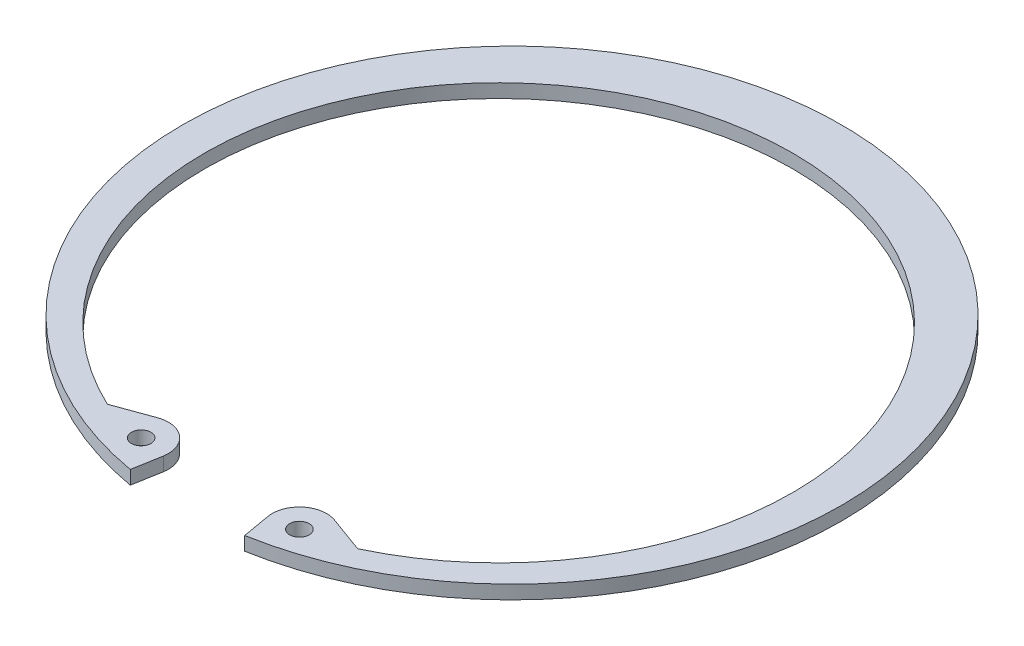
ISO-10303-21;
HEADER;
FILE_DESCRIPTION(('STEP AP214'),'2;1');
FILE_NAME('part.step','',(''),(''),'','','');
FILE_SCHEMA(('AUTOMOTIVE_DESIGN { 1 0 10303 214 1 1 1 1 }'));
ENDSEC;
DATA;
#1=APPLICATION_CONTEXT('core data for automotive mechanical design processes');
#2=APPLICATION_PROTOCOL_DEFINITION('international standard','automotive_design',2000,#1);
#3=PRODUCT_CONTEXT('',#1,'mechanical');
#4=PRODUCT('Part','Part','',(#3));
#5=PRODUCT_RELATED_PRODUCT_CATEGORY('part','',(#4));
#6=PRODUCT_DEFINITION_FORMATION('','',#4);
#7=PRODUCT_DEFINITION_CONTEXT('part definition',#1,'design');
#8=PRODUCT_DEFINITION('design','',#6,#7);
#9=PRODUCT_DEFINITION_SHAPE('','',#8);
#10=(LENGTH_UNIT() NAMED_UNIT(*) SI_UNIT(.MILLI.,.METRE.));
#11=(NAMED_UNIT(*) PLANE_ANGLE_UNIT() SI_UNIT($,.RADIAN.));
#12=(NAMED_UNIT(*) SI_UNIT($,.STERADIAN.) SOLID_ANGLE_UNIT());
#13=UNCERTAINTY_MEASURE_WITH_UNIT(LENGTH_MEASURE(1.E-05),#10,'distance_accuracy_value','');
#14=(GEOMETRIC_REPRESENTATION_CONTEXT(3) GLOBAL_UNCERTAINTY_ASSIGNED_CONTEXT((#13)) GLOBAL_UNIT_ASSIGNED_CONTEXT((#10,
#11,#12)) REPRESENTATION_CONTEXT('',''));
#15=CARTESIAN_POINT('',(0.,0.,0.));
#16=DIRECTION('',(0.,0.,1.));
#17=DIRECTION('',(1.,0.,0.));
#18=AXIS2_PLACEMENT_3D('',#15,#16,#17);
#19=CARTESIAN_POINT('',(16.0379644782758,-2.7686,59.1414888351956));
#20=DIRECTION('',(0.,1.,0.));
#21=DIRECTION('',(0.,0.,1.));
#22=AXIS2_PLACEMENT_3D('',#19,#20,#21);
#23=CYLINDRICAL_SURFACE('',#22,5.5245);
#24=CARTESIAN_POINT('',(16.0379644782758,0.,59.1414888351956));
#25=DIRECTION('',(0.,1.,0.));
#26=DIRECTION('',(0.,0.,-1.));
#27=AXIS2_PLACEMENT_3D('',#24,#25,#26);
#28=CIRCLE('',#27,5.5245);
#29=CARTESIAN_POINT('',(17.9274547600785,0.,53.9501569516638));
#30=VERTEX_POINT('',#29);
#31=CARTESIAN_POINT('',(10.5973940467599,0.,60.1008081927165));
#32=VERTEX_POINT('',#31);
#33=EDGE_CURVE('E160',#30,#32,#28,.T.);
#34=ORIENTED_EDGE('',*,*,#33,.F.);
#35=DIRECTION('',(0.,1.,0.));
#36=VECTOR('',#35,1.);
#37=CARTESIAN_POINT('',(17.9274547600785,-2.7686,53.9501569516638));
#38=LINE('',#37,#36);
#39=CARTESIAN_POINT('',(17.9274547600785,-2.7686,53.9501569516638));
#40=VERTEX_POINT('',#39);
#41=EDGE_CURVE('E137',#40,#30,#38,.T.);
#42=ORIENTED_EDGE('',*,*,#41,.F.);
#43=CARTESIAN_POINT('',(16.0379644782758,-2.7686,59.1414888351956));
#44=DIRECTION('',(0.,1.,0.));
#45=DIRECTION('',(0.,0.,-1.));
#46=AXIS2_PLACEMENT_3D('',#43,#44,#45);
#47=CIRCLE('',#46,5.5245);
#48=CARTESIAN_POINT('',(10.5973940467599,-2.7686,60.1008081927165));
#49=VERTEX_POINT('',#48);
#50=EDGE_CURVE('E130',#40,#49,#47,.T.);
#51=ORIENTED_EDGE('',*,*,#50,.T.);
#52=DIRECTION('',(0.,1.,0.));
#53=VECTOR('',#52,1.);
#54=CARTESIAN_POINT('',(10.5973940467599,-2.7686,60.1008081927165));
#55=LINE('',#54,#53);
#56=EDGE_CURVE('E113',#49,#32,#55,.T.);
#57=ORIENTED_EDGE('',*,*,#56,.T.);
#58=EDGE_LOOP('',(#34,#42,#51,#57));
#59=FACE_BOUND('',#58,.T.);
#60=ADVANCED_FACE('F38',(#59),#23,.T.);
#61=CARTESIAN_POINT('',(25.3672468382028,-2.7686,56.6580198172306));
#62=DIRECTION('',(0.342020143325672,0.,-0.939692620785907));
#63=DIRECTION('',(-0.939692620785907,0.,-0.342020143325672));
#64=AXIS2_PLACEMENT_3D('',#61,#62,#63);
#65=PLANE('',#64);
#66=DIRECTION('',(-0.939692620785907,0.,-0.342020143325672));
#67=VECTOR('',#66,1.);
#68=CARTESIAN_POINT('',(25.3672468382028,0.,56.6580198172306));
#69=LINE('',#68,#67);
#70=CARTESIAN_POINT('',(25.2678041406054,0.,56.62182563529));
#71=VERTEX_POINT('',#70);
#72=EDGE_CURVE('E138',#71,#30,#69,.T.);
#73=ORIENTED_EDGE('',*,*,#72,.F.);
#74=DIRECTION('',(0.,-1.,0.));
#75=VECTOR('',#74,1.);
#76=CARTESIAN_POINT('',(25.2678041406054,-2.7686,56.62182563529));
#77=LINE('',#76,#75);
#78=CARTESIAN_POINT('',(25.2678041406054,-2.7686,56.62182563529));
#79=VERTEX_POINT('',#78);
#80=EDGE_CURVE('E53',#71,#79,#77,.T.);
#81=ORIENTED_EDGE('',*,*,#80,.T.);
#82=DIRECTION('',(-0.939692620785907,0.,-0.342020143325672));
#83=VECTOR('',#82,1.);
#84=CARTESIAN_POINT('',(25.3672468382028,-2.7686,56.6580198172306));
#85=LINE('',#84,#83);
#86=EDGE_CURVE('E124',#79,#40,#85,.T.);
#87=ORIENTED_EDGE('',*,*,#86,.T.);
#88=ORIENTED_EDGE('',*,*,#41,.T.);
#89=EDGE_LOOP('',(#73,#81,#87,#88));
#90=FACE_BOUND('',#89,.T.);
#91=ADVANCED_FACE('F215',(#90),#65,.T.);
#92=CARTESIAN_POINT('',(0.,-2.7686,2.71445082592515));
#93=DIRECTION('',(0.,1.,0.));
#94=DIRECTION('',(0.,0.,1.));
#95=AXIS2_PLACEMENT_3D('',#92,#93,#94);
#96=CYLINDRICAL_SURFACE('',#95,59.6104508259251);
#97=CARTESIAN_POINT('',(0.,0.,2.71445082592515));
#98=DIRECTION('',(0.,-1.,0.));
#99=DIRECTION('',(0.,0.,1.));
#100=AXIS2_PLACEMENT_3D('',#97,#98,#99);
#101=CIRCLE('',#100,59.6104508259251);
#102=CARTESIAN_POINT('',(-25.4631757931198,0.,56.6128044760944));
#103=VERTEX_POINT('',#102);
#104=CARTESIAN_POINT('',(25.4631757931198,0.,56.6128044760945));
#105=VERTEX_POINT('',#104);
#106=EDGE_CURVE('E140',#103,#105,#101,.T.);
#107=ORIENTED_EDGE('',*,*,#106,.F.);
#108=DIRECTION('',(0.,1.,0.));
#109=VECTOR('',#108,1.);
#110=CARTESIAN_POINT('',(-25.4631757931198,-2.7686,56.6128044760944));
#111=LINE('',#110,#109);
#112=CARTESIAN_POINT('',(-25.4631757931198,-2.7686,56.6128044760944));
#113=VERTEX_POINT('',#112);
#114=EDGE_CURVE('E191',#103,#113,#111,.F.);
#115=ORIENTED_EDGE('',*,*,#114,.T.);
#116=CARTESIAN_POINT('',(0.,-2.7686,2.71445082592515));
#117=DIRECTION('',(0.,-1.,0.));
#118=DIRECTION('',(0.,0.,1.));
#119=AXIS2_PLACEMENT_3D('',#116,#117,#118);
#120=CIRCLE('',#119,59.6104508259251);
#121=CARTESIAN_POINT('',(25.4631757931198,-2.7686,56.6128044760945));
#122=VERTEX_POINT('',#121);
#123=EDGE_CURVE('E156',#113,#122,#120,.T.);
#124=ORIENTED_EDGE('',*,*,#123,.T.);
#125=DIRECTION('',(0.,1.,0.));
#126=VECTOR('',#125,1.);
#127=CARTESIAN_POINT('',(25.4631757931198,-2.7686,56.6128044760945));
#128=LINE('',#127,#126);
#129=EDGE_CURVE('E188',#122,#105,#128,.T.);
#130=ORIENTED_EDGE('',*,*,#129,.T.);
#131=EDGE_LOOP('',(#107,#115,#124,#130));
#132=FACE_BOUND('',#131,.T.);
#133=ADVANCED_FACE('F211',(#132),#96,.F.);
#134=CARTESIAN_POINT('',(-25.3672468382028,-2.7686,56.6580198172306));
#135=DIRECTION('',(-0.342020143325667,0.,-0.939692620785909));
#136=DIRECTION('',(-0.939692620785909,0.,0.342020143325667));
#137=AXIS2_PLACEMENT_3D('',#134,#135,#136);
#138=PLANE('',#137);
#139=DIRECTION('',(-0.939692620785909,0.,0.342020143325667));
#140=VECTOR('',#139,1.);
#141=CARTESIAN_POINT('',(-25.3672468382028,-2.7686,56.6580198172306));
#142=LINE('',#141,#140);
#143=CARTESIAN_POINT('',(-17.9274547600784,-2.7686,53.9501569516638));
#144=VERTEX_POINT('',#143);
#145=CARTESIAN_POINT('',(-25.2678041406054,-2.7686,56.62182563529));
#146=VERTEX_POINT('',#145);
#147=EDGE_CURVE('E153',#144,#146,#142,.T.);
#148=ORIENTED_EDGE('',*,*,#147,.T.);
#149=DIRECTION('',(0.,-1.,0.));
#150=VECTOR('',#149,1.);
#151=CARTESIAN_POINT('',(-25.2678041406054,0.,56.62182563529));
#152=LINE('',#151,#150);
#153=CARTESIAN_POINT('',(-25.2678041406054,0.,56.62182563529));
#154=VERTEX_POINT('',#153);
#155=EDGE_CURVE('E178',#146,#154,#152,.F.);
#156=ORIENTED_EDGE('',*,*,#155,.T.);
#157=DIRECTION('',(-0.939692620785909,0.,0.342020143325667));
#158=VECTOR('',#157,1.);
#159=CARTESIAN_POINT('',(-25.3672468382028,0.,56.6580198172306));
#160=LINE('',#159,#158);
#161=CARTESIAN_POINT('',(-17.9274547600784,0.,53.9501569516638));
#162=VERTEX_POINT('',#161);
#163=EDGE_CURVE('E173',#162,#154,#160,.T.);
#164=ORIENTED_EDGE('',*,*,#163,.F.);
#165=DIRECTION('',(0.,1.,0.));
#166=VECTOR('',#165,1.);
#167=CARTESIAN_POINT('',(-17.9274547600784,-2.7686,53.9501569516638));
#168=LINE('',#167,#166);
#169=EDGE_CURVE('E179',#144,#162,#168,.T.);
#170=ORIENTED_EDGE('',*,*,#169,.F.);
#171=EDGE_LOOP('',(#148,#156,#164,#170));
#172=FACE_BOUND('',#171,.T.);
#173=ADVANCED_FACE('F205',(#172),#138,.T.);
#174=CARTESIAN_POINT('',(-16.0379644782758,-2.7686,59.1414888351956));
#175=DIRECTION('',(0.,1.,0.));
#176=DIRECTION('',(0.,0.,1.));
#177=AXIS2_PLACEMENT_3D('',#174,#175,#176);
#178=CYLINDRICAL_SURFACE('',#177,5.5245);
#179=CARTESIAN_POINT('',(-16.0379644782758,0.,59.1414888351956));
#180=DIRECTION('',(0.,1.,0.));
#181=DIRECTION('',(0.,0.,1.));
#182=AXIS2_PLACEMENT_3D('',#179,#180,#181);
#183=CIRCLE('',#182,5.5245);
#184=CARTESIAN_POINT('',(-10.5973940467599,0.,60.1008081927165));
#185=VERTEX_POINT('',#184);
#186=EDGE_CURVE('E170',#185,#162,#183,.T.);
#187=ORIENTED_EDGE('',*,*,#186,.F.);
#188=DIRECTION('',(0.,1.,0.));
#189=VECTOR('',#188,1.);
#190=CARTESIAN_POINT('',(-10.5973940467599,-2.7686,60.1008081927165));
#191=LINE('',#190,#189);
#192=CARTESIAN_POINT('',(-10.5973940467599,-2.7686,60.1008081927165));
#193=VERTEX_POINT('',#192);
#194=EDGE_CURVE('E181',#193,#185,#191,.T.);
#195=ORIENTED_EDGE('',*,*,#194,.F.);
#196=CARTESIAN_POINT('',(-16.0379644782758,-2.7686,59.1414888351956));
#197=DIRECTION('',(0.,1.,0.));
#198=DIRECTION('',(0.,0.,1.));
#199=AXIS2_PLACEMENT_3D('',#196,#197,#198);
#200=CIRCLE('',#199,5.5245);
#201=EDGE_CURVE('E150',#193,#144,#200,.T.);
#202=ORIENTED_EDGE('',*,*,#201,.T.);
#203=ORIENTED_EDGE('',*,*,#169,.T.);
#204=EDGE_LOOP('',(#187,#195,#202,#203));
#205=FACE_BOUND('',#204,.T.);
#206=ADVANCED_FACE('F224',(#205),#178,.T.);
#207=CARTESIAN_POINT('',(-11.6000455645058,-2.7686,65.7871275167216));
#208=DIRECTION('',(0.984807753012209,0.,0.173648177666924));
#209=DIRECTION('',(0.173648177666924,0.,-0.984807753012209));
#210=AXIS2_PLACEMENT_3D('',#207,#208,#209);
#211=PLANE('',#210);
#212=DIRECTION('',(0.173648177666924,0.,-0.984807753012209));
#213=VECTOR('',#212,1.);
#214=CARTESIAN_POINT('',(-11.6000455645058,0.,65.7871275167216));
#215=LINE('',#214,#213);
#216=CARTESIAN_POINT('',(-11.6000455645059,0.,65.7871275167216));
#217=VERTEX_POINT('',#216);
#218=EDGE_CURVE('E167',#217,#185,#215,.T.);
#219=ORIENTED_EDGE('',*,*,#218,.F.);
#220=DIRECTION('',(0.,1.,0.));
#221=VECTOR('',#220,1.);
#222=CARTESIAN_POINT('',(-11.6000455645059,-2.7686,65.7871275167216));
#223=LINE('',#222,#221);
#224=CARTESIAN_POINT('',(-11.6000455645059,-2.7686,65.7871275167216));
#225=VERTEX_POINT('',#224);
#226=EDGE_CURVE('E183',#225,#217,#223,.T.);
#227=ORIENTED_EDGE('',*,*,#226,.F.);
#228=DIRECTION('',(0.173648177666924,0.,-0.984807753012209));
#229=VECTOR('',#228,1.);
#230=CARTESIAN_POINT('',(-11.6000455645058,-2.7686,65.7871275167216));
#231=LINE('',#230,#229);
#232=EDGE_CURVE('E147',#225,#193,#231,.T.);
#233=ORIENTED_EDGE('',*,*,#232,.T.);
#234=ORIENTED_EDGE('',*,*,#194,.T.);
#235=EDGE_LOOP('',(#219,#227,#233,#234));
#236=FACE_BOUND('',#235,.T.);
#237=ADVANCED_FACE('F221',(#236),#211,.T.);
#238=CARTESIAN_POINT('',(0.,-2.7686,0.));
#239=DIRECTION('',(0.,1.,0.));
#240=DIRECTION('',(0.,0.,1.));
#241=AXIS2_PLACEMENT_3D('',#238,#239,#240);
#242=CYLINDRICAL_SURFACE('',#241,66.802);
#243=CARTESIAN_POINT('',(0.,0.,0.));
#244=DIRECTION('',(0.,1.,0.));
#245=DIRECTION('',(0.,0.,1.));
#246=AXIS2_PLACEMENT_3D('',#243,#244,#245);
#247=CIRCLE('',#246,66.802);
#248=CARTESIAN_POINT('',(11.6000455645058,0.,65.7871275167216));
#249=VERTEX_POINT('',#248);
#250=EDGE_CURVE('E164',#249,#217,#247,.T.);
#251=ORIENTED_EDGE('',*,*,#250,.F.);
#252=DIRECTION('',(0.,1.,0.));
#253=VECTOR('',#252,1.);
#254=CARTESIAN_POINT('',(11.6000455645058,-2.7686,65.7871275167216));
#255=LINE('',#254,#253);
#256=CARTESIAN_POINT('',(11.6000455645058,-2.7686,65.7871275167216));
#257=VERTEX_POINT('',#256);
#258=EDGE_CURVE('E123',#257,#249,#255,.T.);
#259=ORIENTED_EDGE('',*,*,#258,.F.);
#260=CARTESIAN_POINT('',(0.,-2.7686,0.));
#261=DIRECTION('',(0.,1.,0.));
#262=DIRECTION('',(0.,0.,1.));
#263=AXIS2_PLACEMENT_3D('',#260,#261,#262);
#264=CIRCLE('',#263,66.802);
#265=EDGE_CURVE('E133',#257,#225,#264,.T.);
#266=ORIENTED_EDGE('',*,*,#265,.T.);
#267=ORIENTED_EDGE('',*,*,#226,.T.);
#268=EDGE_LOOP('',(#251,#259,#266,#267));
#269=FACE_BOUND('',#268,.T.);
#270=ADVANCED_FACE('F219',(#269),#242,.T.);
#271=CARTESIAN_POINT('',(11.6000455645058,-2.7686,65.7871275167216));
#272=DIRECTION('',(-0.984807753012209,0.,0.173648177666924));
#273=DIRECTION('',(0.173648177666924,0.,0.984807753012209));
#274=AXIS2_PLACEMENT_3D('',#271,#272,#273);
#275=PLANE('',#274);
#276=DIRECTION('',(0.173648177666924,0.,0.984807753012209));
#277=VECTOR('',#276,1.);
#278=CARTESIAN_POINT('',(11.6000455645058,0.,65.7871275167216));
#279=LINE('',#278,#277);
#280=EDGE_CURVE('E118',#32,#249,#279,.T.);
#281=ORIENTED_EDGE('',*,*,#280,.F.);
#282=ORIENTED_EDGE('',*,*,#56,.F.);
#283=DIRECTION('',(0.173648177666924,0.,0.984807753012209));
#284=VECTOR('',#283,1.);
#285=CARTESIAN_POINT('',(11.6000455645058,-2.7686,65.7871275167216));
#286=LINE('',#285,#284);
#287=EDGE_CURVE('E116',#49,#257,#286,.T.);
#288=ORIENTED_EDGE('',*,*,#287,.T.);
#289=ORIENTED_EDGE('',*,*,#258,.T.);
#290=EDGE_LOOP('',(#281,#282,#288,#289));
#291=FACE_BOUND('',#290,.T.);
#292=ADVANCED_FACE('F115',(#291),#275,.T.);
#293=CARTESIAN_POINT('',(16.0379644782758,-2.7686,59.1414888351956));
#294=DIRECTION('',(0.,-1.,0.));
#295=DIRECTION('',(0.,0.,-1.));
#296=AXIS2_PLACEMENT_3D('',#293,#294,#295);
#297=PLANE('',#296);
#298=CARTESIAN_POINT('',(-16.0379644782758,-2.7686,59.1414888351956));
#299=DIRECTION('',(0.,1.,0.));
#300=DIRECTION('',(0.,0.,1.));
#301=AXIS2_PLACEMENT_3D('',#298,#299,#300);
#302=CIRCLE('',#301,1.9812);
#303=CARTESIAN_POINT('',(-16.0379644782758,-2.7686,61.1226888351956));
#304=VERTEX_POINT('',#303);
#305=EDGE_CURVE('E369',#304,#304,#302,.T.);
#306=ORIENTED_EDGE('',*,*,#305,.T.);
#307=EDGE_LOOP('',(#306));
#308=FACE_BOUND('',#307,.T.);
#309=CARTESIAN_POINT('',(16.0379644782758,-2.7686,59.1414888351956));
#310=DIRECTION('',(0.,1.,0.));
#311=DIRECTION('',(0.,0.,1.));
#312=AXIS2_PLACEMENT_3D('',#309,#310,#311);
#313=CIRCLE('',#312,1.9812);
#314=CARTESIAN_POINT('',(16.0379644782758,-2.7686,61.1226888351956));
#315=VERTEX_POINT('',#314);
#316=EDGE_CURVE('E162',#315,#315,#313,.T.);
#317=ORIENTED_EDGE('',*,*,#316,.T.);
#318=EDGE_LOOP('',(#317));
#319=FACE_BOUND('',#318,.T.);
#320=ORIENTED_EDGE('',*,*,#50,.F.);
#321=ORIENTED_EDGE('',*,*,#86,.F.);
#322=CARTESIAN_POINT('',(25.3546772570101,-2.7686,56.3831437096104));
#323=DIRECTION('',(0.,-1.,0.));
#324=DIRECTION('',(0.,0.,-1.));
#325=AXIS2_PLACEMENT_3D('',#322,#323,#324);
#326=CIRCLE('',#325,0.254);
#327=EDGE_CURVE('E11',#79,#122,#326,.F.);
#328=ORIENTED_EDGE('',*,*,#327,.T.);
#329=ORIENTED_EDGE('',*,*,#123,.F.);
#330=CARTESIAN_POINT('',(-25.3546772570101,-2.7686,56.3831437096103));
#331=DIRECTION('',(0.,-1.,0.));
#332=DIRECTION('',(0.,0.,-1.));
#333=AXIS2_PLACEMENT_3D('',#330,#331,#332);
#334=CIRCLE('',#333,0.254);
#335=EDGE_CURVE('E196',#113,#146,#334,.F.);
#336=ORIENTED_EDGE('',*,*,#335,.T.);
#337=ORIENTED_EDGE('',*,*,#147,.F.);
#338=ORIENTED_EDGE('',*,*,#201,.F.);
#339=ORIENTED_EDGE('',*,*,#232,.F.);
#340=ORIENTED_EDGE('',*,*,#265,.F.);
#341=ORIENTED_EDGE('',*,*,#287,.F.);
#342=EDGE_LOOP('',(#320,#321,#328,#329,#336,#337,#338,#339,#340,#341));
#343=FACE_BOUND('',#342,.T.);
#344=ADVANCED_FACE('F129',(#308,#319,#343),#297,.T.);
#345=CARTESIAN_POINT('',(16.0379644782758,0.,59.1414888351956));
#346=DIRECTION('',(0.,-1.,0.));
#347=DIRECTION('',(0.,0.,-1.));
#348=AXIS2_PLACEMENT_3D('',#345,#346,#347);
#349=PLANE('',#348);
#350=CARTESIAN_POINT('',(-16.0379644782758,0.,59.1414888351956));
#351=DIRECTION('',(0.,1.,0.));
#352=DIRECTION('',(0.,0.,1.));
#353=AXIS2_PLACEMENT_3D('',#350,#351,#352);
#354=CIRCLE('',#353,1.9812);
#355=CARTESIAN_POINT('',(-16.0379644782758,0.,61.1226888351956));
#356=VERTEX_POINT('',#355);
#357=EDGE_CURVE('E365',#356,#356,#354,.T.);
#358=ORIENTED_EDGE('',*,*,#357,.F.);
#359=EDGE_LOOP('',(#358));
#360=FACE_BOUND('',#359,.T.);
#361=CARTESIAN_POINT('',(16.0379644782758,0.,59.1414888351956));
#362=DIRECTION('',(0.,1.,0.));
#363=DIRECTION('',(0.,0.,1.));
#364=AXIS2_PLACEMENT_3D('',#361,#362,#363);
#365=CIRCLE('',#364,1.9812);
#366=CARTESIAN_POINT('',(16.0379644782758,0.,61.1226888351956));
#367=VERTEX_POINT('',#366);
#368=EDGE_CURVE('E143',#367,#367,#365,.T.);
#369=ORIENTED_EDGE('',*,*,#368,.F.);
#370=EDGE_LOOP('',(#369));
#371=FACE_BOUND('',#370,.T.);
#372=ORIENTED_EDGE('',*,*,#33,.T.);
#373=ORIENTED_EDGE('',*,*,#280,.T.);
#374=ORIENTED_EDGE('',*,*,#250,.T.);
#375=ORIENTED_EDGE('',*,*,#218,.T.);
#376=ORIENTED_EDGE('',*,*,#186,.T.);
#377=ORIENTED_EDGE('',*,*,#163,.T.);
#378=CARTESIAN_POINT('',(-25.3546772570101,0.,56.3831437096103));
#379=DIRECTION('',(0.,-1.,0.));
#380=DIRECTION('',(0.,0.,-1.));
#381=AXIS2_PLACEMENT_3D('',#378,#379,#380);
#382=CIRCLE('',#381,0.254);
#383=EDGE_CURVE('E194',#154,#103,#382,.T.);
#384=ORIENTED_EDGE('',*,*,#383,.T.);
#385=ORIENTED_EDGE('',*,*,#106,.T.);
#386=CARTESIAN_POINT('',(25.3546772570101,0.,56.3831437096104));
#387=DIRECTION('',(0.,-1.,0.));
#388=DIRECTION('',(0.,0.,-1.));
#389=AXIS2_PLACEMENT_3D('',#386,#387,#388);
#390=CIRCLE('',#389,0.254);
#391=EDGE_CURVE('E46',#105,#71,#390,.T.);
#392=ORIENTED_EDGE('',*,*,#391,.T.);
#393=ORIENTED_EDGE('',*,*,#72,.T.);
#394=EDGE_LOOP('',(#372,#373,#374,#375,#376,#377,#384,#385,#392,#393));
#395=FACE_BOUND('',#394,.T.);
#396=ADVANCED_FACE('F209',(#360,#371,#395),#349,.F.);
#397=CARTESIAN_POINT('',(16.0379644782758,-2.7686,59.1414888351956));
#398=DIRECTION('',(0.,1.,0.));
#399=DIRECTION('',(0.,0.,1.));
#400=AXIS2_PLACEMENT_3D('',#397,#398,#399);
#401=CYLINDRICAL_SURFACE('',#400,1.9812);
#402=ORIENTED_EDGE('',*,*,#316,.F.);
#403=EDGE_LOOP('',(#402));
#404=FACE_BOUND('',#403,.T.);
#405=ORIENTED_EDGE('',*,*,#368,.T.);
#406=EDGE_LOOP('',(#405));
#407=FACE_BOUND('',#406,.T.);
#408=ADVANCED_FACE('F247',(#404,#407),#401,.F.);
#409=CARTESIAN_POINT('',(-16.0379644782758,-2.7686,59.1414888351956));
#410=DIRECTION('',(0.,1.,0.));
#411=DIRECTION('',(0.,0.,1.));
#412=AXIS2_PLACEMENT_3D('',#409,#410,#411);
#413=CYLINDRICAL_SURFACE('',#412,1.9812);
#414=ORIENTED_EDGE('',*,*,#305,.F.);
#415=EDGE_LOOP('',(#414));
#416=FACE_BOUND('',#415,.T.);
#417=ORIENTED_EDGE('',*,*,#357,.T.);
#418=EDGE_LOOP('',(#417));
#419=FACE_BOUND('',#418,.T.);
#420=ADVANCED_FACE('F242',(#416,#419),#413,.F.);
#421=CARTESIAN_POINT('',(-25.3546772570101,-2.7686,56.3831437096103));
#422=DIRECTION('',(0.,1.,0.));
#423=DIRECTION('',(0.,0.,1.));
#424=AXIS2_PLACEMENT_3D('',#421,#422,#423);
#425=CYLINDRICAL_SURFACE('',#424,0.254);
#426=ORIENTED_EDGE('',*,*,#335,.F.);
#427=ORIENTED_EDGE('',*,*,#114,.F.);
#428=ORIENTED_EDGE('',*,*,#383,.F.);
#429=ORIENTED_EDGE('',*,*,#155,.F.);
#430=EDGE_LOOP('',(#426,#427,#428,#429));
#431=FACE_BOUND('',#430,.T.);
#432=ADVANCED_FACE('F207',(#431),#425,.F.);
#433=CARTESIAN_POINT('',(25.3546772570101,-2.7686,56.3831437096104));
#434=DIRECTION('',(0.,1.,0.));
#435=DIRECTION('',(0.,0.,1.));
#436=AXIS2_PLACEMENT_3D('',#433,#434,#435);
#437=CYLINDRICAL_SURFACE('',#436,0.254);
#438=ORIENTED_EDGE('',*,*,#327,.F.);
#439=ORIENTED_EDGE('',*,*,#80,.F.);
#440=ORIENTED_EDGE('',*,*,#391,.F.);
#441=ORIENTED_EDGE('',*,*,#129,.F.);
#442=EDGE_LOOP('',(#438,#439,#440,#441));
#443=FACE_BOUND('',#442,.T.);
#444=ADVANCED_FACE('F40',(#443),#437,.F.);
#445=CLOSED_SHELL('',(#60,#91,#133,#173,#206,#237,#270,#292,#344,#396,#408,#420,#432,#444));
#446=MANIFOLD_SOLID_BREP('B2',#445);
#447=ADVANCED_BREP_SHAPE_REPRESENTATION('',(#18,#446),#14);
#448=SHAPE_DEFINITION_REPRESENTATION(#9,#447);
ENDSEC;
END-ISO-10303-21;
